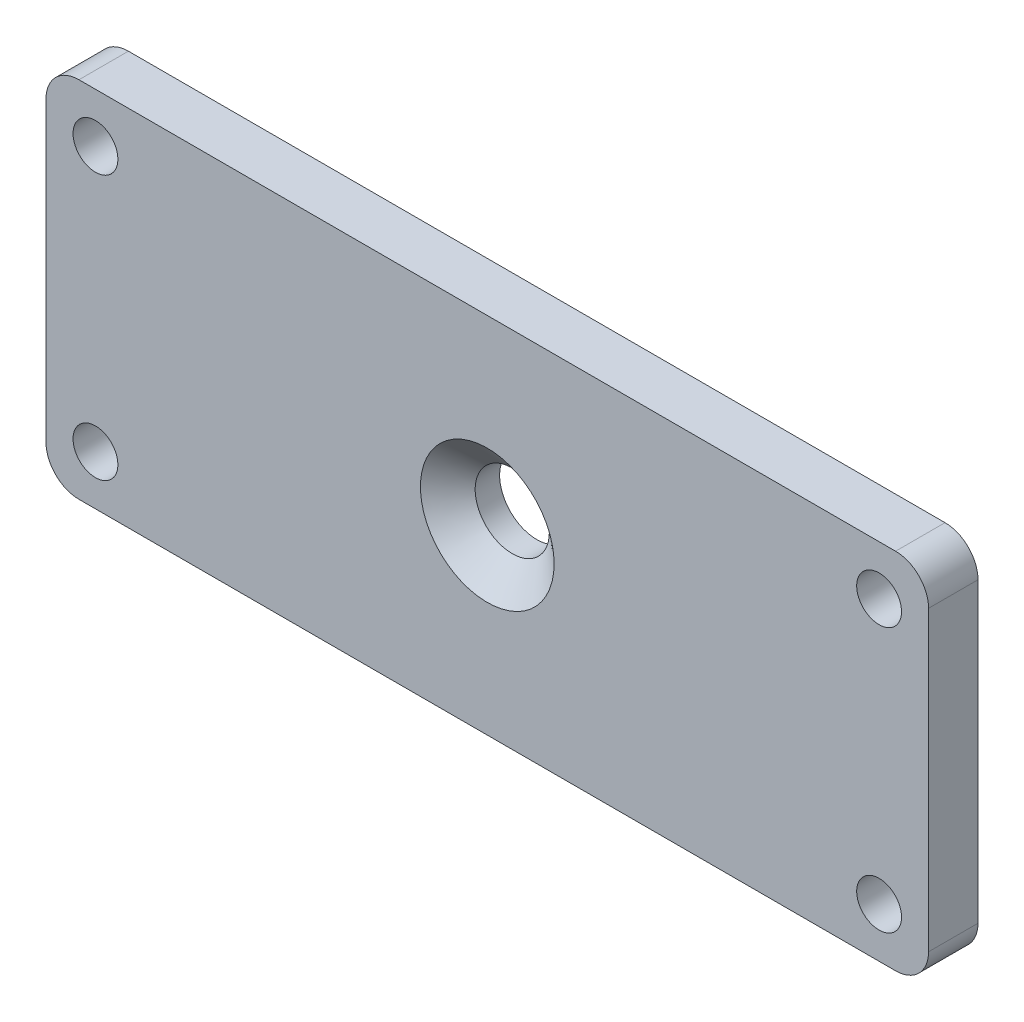
ISO-10303-21;
HEADER;
FILE_DESCRIPTION(('STEP AP214'),'2;1');
FILE_NAME('part.step','',(''),(''),'','','');
FILE_SCHEMA(('AUTOMOTIVE_DESIGN { 1 0 10303 214 1 1 1 1 }'));
ENDSEC;
DATA;
#1=APPLICATION_CONTEXT('core data for automotive mechanical design processes');
#2=APPLICATION_PROTOCOL_DEFINITION('international standard','automotive_design',2000,#1);
#3=PRODUCT_CONTEXT('',#1,'mechanical');
#4=PRODUCT('Part','Part','',(#3));
#5=PRODUCT_RELATED_PRODUCT_CATEGORY('part','',(#4));
#6=PRODUCT_DEFINITION_FORMATION('','',#4);
#7=PRODUCT_DEFINITION_CONTEXT('part definition',#1,'design');
#8=PRODUCT_DEFINITION('design','',#6,#7);
#9=PRODUCT_DEFINITION_SHAPE('','',#8);
#10=(LENGTH_UNIT() NAMED_UNIT(*) SI_UNIT(.MILLI.,.METRE.));
#11=(NAMED_UNIT(*) PLANE_ANGLE_UNIT() SI_UNIT($,.RADIAN.));
#12=(NAMED_UNIT(*) SI_UNIT($,.STERADIAN.) SOLID_ANGLE_UNIT());
#13=UNCERTAINTY_MEASURE_WITH_UNIT(LENGTH_MEASURE(1.E-05),#10,'distance_accuracy_value','');
#14=(GEOMETRIC_REPRESENTATION_CONTEXT(3) GLOBAL_UNCERTAINTY_ASSIGNED_CONTEXT((#13)) GLOBAL_UNIT_ASSIGNED_CONTEXT((#10,
#11,#12)) REPRESENTATION_CONTEXT('',''));
#15=CARTESIAN_POINT('',(0.,0.,0.));
#16=DIRECTION('',(0.,0.,1.));
#17=DIRECTION('',(1.,0.,0.));
#18=AXIS2_PLACEMENT_3D('',#15,#16,#17);
#19=CARTESIAN_POINT('',(42.5,17.5,-4.76250000000002));
#20=DIRECTION('',(0.,0.,1.));
#21=DIRECTION('',(1.,0.,0.));
#22=AXIS2_PLACEMENT_3D('',#19,#20,#21);
#23=PLANE('',#22);
#24=CARTESIAN_POINT('',(0.,0.,-4.76250000000002));
#25=DIRECTION('',(0.,0.,1.));
#26=DIRECTION('',(1.,0.,0.));
#27=AXIS2_PLACEMENT_3D('',#24,#25,#26);
#28=CIRCLE('',#27,3.57123999999999);
#29=CARTESIAN_POINT('',(3.57123999999999,0.,-4.76250000000002));
#30=VERTEX_POINT('',#29);
#31=EDGE_CURVE('E240',#30,#30,#28,.T.);
#32=ORIENTED_EDGE('',*,*,#31,.T.);
#33=EDGE_LOOP('',(#32));
#34=FACE_BOUND('',#33,.T.);
#35=CARTESIAN_POINT('',(-37.7375,-12.7375,-4.76250000000001));
#36=DIRECTION('',(0.,0.,1.));
#37=DIRECTION('',(1.,0.,0.));
#38=AXIS2_PLACEMENT_3D('',#35,#36,#37);
#39=CIRCLE('',#38,2.159);
#40=CARTESIAN_POINT('',(-35.5785,-12.7375,-4.76250000000001));
#41=VERTEX_POINT('',#40);
#42=EDGE_CURVE('E259',#41,#41,#39,.T.);
#43=ORIENTED_EDGE('',*,*,#42,.T.);
#44=EDGE_LOOP('',(#43));
#45=FACE_BOUND('',#44,.T.);
#46=CARTESIAN_POINT('',(37.7375,12.7375,-4.76250000000002));
#47=DIRECTION('',(0.,0.,1.));
#48=DIRECTION('',(1.,0.,0.));
#49=AXIS2_PLACEMENT_3D('',#46,#47,#48);
#50=CIRCLE('',#49,2.159);
#51=CARTESIAN_POINT('',(39.8965,12.7375,-4.76250000000002));
#52=VERTEX_POINT('',#51);
#53=EDGE_CURVE('E256',#52,#52,#50,.T.);
#54=ORIENTED_EDGE('',*,*,#53,.T.);
#55=EDGE_LOOP('',(#54));
#56=FACE_BOUND('',#55,.T.);
#57=CARTESIAN_POINT('',(37.7375,-12.7375,-4.76250000000002));
#58=DIRECTION('',(0.,0.,1.));
#59=DIRECTION('',(1.,0.,0.));
#60=AXIS2_PLACEMENT_3D('',#57,#58,#59);
#61=CIRCLE('',#60,2.159);
#62=CARTESIAN_POINT('',(39.8965,-12.7375,-4.76250000000002));
#63=VERTEX_POINT('',#62);
#64=EDGE_CURVE('E248',#63,#63,#61,.T.);
#65=ORIENTED_EDGE('',*,*,#64,.T.);
#66=EDGE_LOOP('',(#65));
#67=FACE_BOUND('',#66,.T.);
#68=CARTESIAN_POINT('',(-37.7375,12.7375,-4.76250000000001));
#69=DIRECTION('',(0.,0.,1.));
#70=DIRECTION('',(1.,0.,0.));
#71=AXIS2_PLACEMENT_3D('',#68,#69,#70);
#72=CIRCLE('',#71,2.159);
#73=CARTESIAN_POINT('',(-35.5785,12.7375,-4.76250000000001));
#74=VERTEX_POINT('',#73);
#75=EDGE_CURVE('E166',#74,#74,#72,.T.);
#76=ORIENTED_EDGE('',*,*,#75,.T.);
#77=EDGE_LOOP('',(#76));
#78=FACE_BOUND('',#77,.T.);
#79=DIRECTION('',(0.,-1.,0.));
#80=VECTOR('',#79,1.);
#81=CARTESIAN_POINT('',(42.5,17.5,-4.76250000000002));
#82=LINE('',#81,#80);
#83=CARTESIAN_POINT('',(42.5,14.325,-4.76250000000002));
#84=VERTEX_POINT('',#83);
#85=CARTESIAN_POINT('',(42.5,-14.325,-4.76250000000002));
#86=VERTEX_POINT('',#85);
#87=EDGE_CURVE('E102',#84,#86,#82,.T.);
#88=ORIENTED_EDGE('',*,*,#87,.T.);
#89=CARTESIAN_POINT('',(39.325,-14.325,-4.76250000000002));
#90=DIRECTION('',(0.,0.,1.));
#91=DIRECTION('',(1.,0.,0.));
#92=AXIS2_PLACEMENT_3D('',#89,#90,#91);
#93=CIRCLE('',#92,3.175);
#94=CARTESIAN_POINT('',(39.325,-17.5,-4.76250000000002));
#95=VERTEX_POINT('',#94);
#96=EDGE_CURVE('E135',#86,#95,#93,.F.);
#97=ORIENTED_EDGE('',*,*,#96,.T.);
#98=DIRECTION('',(-1.,0.,0.));
#99=VECTOR('',#98,1.);
#100=CARTESIAN_POINT('',(42.5,-17.5,-4.76250000000002));
#101=LINE('',#100,#99);
#102=CARTESIAN_POINT('',(-39.325,-17.5,-4.76250000000001));
#103=VERTEX_POINT('',#102);
#104=EDGE_CURVE('E163',#95,#103,#101,.T.);
#105=ORIENTED_EDGE('',*,*,#104,.T.);
#106=CARTESIAN_POINT('',(-39.325,-14.325,-4.76250000000001));
#107=DIRECTION('',(0.,0.,1.));
#108=DIRECTION('',(1.,0.,0.));
#109=AXIS2_PLACEMENT_3D('',#106,#107,#108);
#110=CIRCLE('',#109,3.175);
#111=CARTESIAN_POINT('',(-42.5,-14.325,-4.76250000000001));
#112=VERTEX_POINT('',#111);
#113=EDGE_CURVE('E108',#103,#112,#110,.F.);
#114=ORIENTED_EDGE('',*,*,#113,.T.);
#115=DIRECTION('',(0.,-1.,0.));
#116=VECTOR('',#115,1.);
#117=CARTESIAN_POINT('',(-42.5,17.5,-4.76250000000001));
#118=LINE('',#117,#116);
#119=CARTESIAN_POINT('',(-42.5,14.325,-4.76250000000001));
#120=VERTEX_POINT('',#119);
#121=EDGE_CURVE('E125',#120,#112,#118,.T.);
#122=ORIENTED_EDGE('',*,*,#121,.F.);
#123=CARTESIAN_POINT('',(-39.325,14.325,-4.76250000000001));
#124=DIRECTION('',(0.,0.,1.));
#125=DIRECTION('',(1.,0.,0.));
#126=AXIS2_PLACEMENT_3D('',#123,#124,#125);
#127=CIRCLE('',#126,3.175);
#128=CARTESIAN_POINT('',(-39.325,17.5,-4.76250000000001));
#129=VERTEX_POINT('',#128);
#130=EDGE_CURVE('E109',#120,#129,#127,.F.);
#131=ORIENTED_EDGE('',*,*,#130,.T.);
#132=DIRECTION('',(-1.,0.,0.));
#133=VECTOR('',#132,1.);
#134=CARTESIAN_POINT('',(42.5,17.5,-4.76250000000002));
#135=LINE('',#134,#133);
#136=CARTESIAN_POINT('',(39.325,17.5,-4.76250000000002));
#137=VERTEX_POINT('',#136);
#138=EDGE_CURVE('E104',#137,#129,#135,.T.);
#139=ORIENTED_EDGE('',*,*,#138,.F.);
#140=CARTESIAN_POINT('',(39.325,14.325,-4.76250000000002));
#141=DIRECTION('',(0.,0.,1.));
#142=DIRECTION('',(1.,0.,0.));
#143=AXIS2_PLACEMENT_3D('',#140,#141,#142);
#144=CIRCLE('',#143,3.175);
#145=EDGE_CURVE('E100',#137,#84,#144,.F.);
#146=ORIENTED_EDGE('',*,*,#145,.T.);
#147=EDGE_LOOP('',(#88,#97,#105,#114,#122,#131,#139,#146));
#148=FACE_BOUND('',#147,.T.);
#149=ADVANCED_FACE('F33',(#34,#45,#56,#67,#78,#148),#23,.F.);
#150=CARTESIAN_POINT('',(-42.5,17.5,-4.76250000000001));
#151=DIRECTION('',(1.,0.,0.));
#152=DIRECTION('',(0.,0.,-1.));
#153=AXIS2_PLACEMENT_3D('',#150,#151,#152);
#154=PLANE('',#153);
#155=ORIENTED_EDGE('',*,*,#121,.T.);
#156=DIRECTION('',(0.,0.,1.));
#157=VECTOR('',#156,1.);
#158=CARTESIAN_POINT('',(-42.5,-14.325,-4.76250000000001));
#159=LINE('',#158,#157);
#160=CARTESIAN_POINT('',(-42.5,-14.325,0.));
#161=VERTEX_POINT('',#160);
#162=EDGE_CURVE('E148',#112,#161,#159,.T.);
#163=ORIENTED_EDGE('',*,*,#162,.T.);
#164=DIRECTION('',(0.,-1.,0.));
#165=VECTOR('',#164,1.);
#166=CARTESIAN_POINT('',(-42.5,17.5,0.));
#167=LINE('',#166,#165);
#168=CARTESIAN_POINT('',(-42.5,14.325,0.));
#169=VERTEX_POINT('',#168);
#170=EDGE_CURVE('E129',#169,#161,#167,.T.);
#171=ORIENTED_EDGE('',*,*,#170,.F.);
#172=DIRECTION('',(0.,0.,1.));
#173=VECTOR('',#172,1.);
#174=CARTESIAN_POINT('',(-42.5,14.325,-4.76250000000001));
#175=LINE('',#174,#173);
#176=EDGE_CURVE('E146',#169,#120,#175,.F.);
#177=ORIENTED_EDGE('',*,*,#176,.T.);
#178=EDGE_LOOP('',(#155,#163,#171,#177));
#179=FACE_BOUND('',#178,.T.);
#180=ADVANCED_FACE('F171',(#179),#154,.F.);
#181=CARTESIAN_POINT('',(-42.5,17.5,0.));
#182=DIRECTION('',(0.,0.,-1.));
#183=DIRECTION('',(-1.,0.,0.));
#184=AXIS2_PLACEMENT_3D('',#181,#182,#183);
#185=PLANE('',#184);
#186=CARTESIAN_POINT('',(0.,0.,0.));
#187=DIRECTION('',(0.,0.,1.));
#188=DIRECTION('',(1.,0.,0.));
#189=AXIS2_PLACEMENT_3D('',#186,#187,#188);
#190=CIRCLE('',#189,6.4389);
#191=CARTESIAN_POINT('',(6.4389,0.,0.));
#192=VERTEX_POINT('',#191);
#193=EDGE_CURVE('E238',#192,#192,#190,.T.);
#194=ORIENTED_EDGE('',*,*,#193,.F.);
#195=EDGE_LOOP('',(#194));
#196=FACE_BOUND('',#195,.T.);
#197=CARTESIAN_POINT('',(-37.7375,-12.7375,0.));
#198=DIRECTION('',(0.,0.,1.));
#199=DIRECTION('',(1.,0.,0.));
#200=AXIS2_PLACEMENT_3D('',#197,#198,#199);
#201=CIRCLE('',#200,2.159);
#202=CARTESIAN_POINT('',(-35.5785,-12.7375,0.));
#203=VERTEX_POINT('',#202);
#204=EDGE_CURVE('E245',#203,#203,#201,.T.);
#205=ORIENTED_EDGE('',*,*,#204,.F.);
#206=EDGE_LOOP('',(#205));
#207=FACE_BOUND('',#206,.T.);
#208=CARTESIAN_POINT('',(37.7375,12.7375,0.));
#209=DIRECTION('',(0.,0.,1.));
#210=DIRECTION('',(1.,0.,0.));
#211=AXIS2_PLACEMENT_3D('',#208,#209,#210);
#212=CIRCLE('',#211,2.159);
#213=CARTESIAN_POINT('',(39.8965,12.7375,0.));
#214=VERTEX_POINT('',#213);
#215=EDGE_CURVE('E249',#214,#214,#212,.T.);
#216=ORIENTED_EDGE('',*,*,#215,.F.);
#217=EDGE_LOOP('',(#216));
#218=FACE_BOUND('',#217,.T.);
#219=CARTESIAN_POINT('',(37.7375,-12.7375,0.));
#220=DIRECTION('',(0.,0.,1.));
#221=DIRECTION('',(1.,0.,0.));
#222=AXIS2_PLACEMENT_3D('',#219,#220,#221);
#223=CIRCLE('',#222,2.159);
#224=CARTESIAN_POINT('',(39.8965,-12.7375,0.));
#225=VERTEX_POINT('',#224);
#226=EDGE_CURVE('E244',#225,#225,#223,.T.);
#227=ORIENTED_EDGE('',*,*,#226,.F.);
#228=EDGE_LOOP('',(#227));
#229=FACE_BOUND('',#228,.T.);
#230=CARTESIAN_POINT('',(-37.7375,12.7375,0.));
#231=DIRECTION('',(0.,0.,1.));
#232=DIRECTION('',(1.,0.,0.));
#233=AXIS2_PLACEMENT_3D('',#230,#231,#232);
#234=CIRCLE('',#233,2.159);
#235=CARTESIAN_POINT('',(-35.5785,12.7375,0.));
#236=VERTEX_POINT('',#235);
#237=EDGE_CURVE('E262',#236,#236,#234,.T.);
#238=ORIENTED_EDGE('',*,*,#237,.F.);
#239=EDGE_LOOP('',(#238));
#240=FACE_BOUND('',#239,.T.);
#241=DIRECTION('',(1.,0.,0.));
#242=VECTOR('',#241,1.);
#243=CARTESIAN_POINT('',(-42.5,-17.5,0.));
#244=LINE('',#243,#242);
#245=CARTESIAN_POINT('',(-39.325,-17.5,0.));
#246=VERTEX_POINT('',#245);
#247=CARTESIAN_POINT('',(39.325,-17.5,0.));
#248=VERTEX_POINT('',#247);
#249=EDGE_CURVE('E159',#246,#248,#244,.T.);
#250=ORIENTED_EDGE('',*,*,#249,.T.);
#251=CARTESIAN_POINT('',(39.325,-14.325,0.));
#252=DIRECTION('',(0.,0.,-1.));
#253=DIRECTION('',(-1.,0.,0.));
#254=AXIS2_PLACEMENT_3D('',#251,#252,#253);
#255=CIRCLE('',#254,3.175);
#256=CARTESIAN_POINT('',(42.5,-14.325,0.));
#257=VERTEX_POINT('',#256);
#258=EDGE_CURVE('E144',#248,#257,#255,.F.);
#259=ORIENTED_EDGE('',*,*,#258,.T.);
#260=DIRECTION('',(0.,-1.,0.));
#261=VECTOR('',#260,1.);
#262=CARTESIAN_POINT('',(42.5,17.5,0.));
#263=LINE('',#262,#261);
#264=CARTESIAN_POINT('',(42.5,14.325,0.));
#265=VERTEX_POINT('',#264);
#266=EDGE_CURVE('E119',#265,#257,#263,.T.);
#267=ORIENTED_EDGE('',*,*,#266,.F.);
#268=CARTESIAN_POINT('',(39.325,14.325,0.));
#269=DIRECTION('',(0.,0.,-1.));
#270=DIRECTION('',(-1.,0.,0.));
#271=AXIS2_PLACEMENT_3D('',#268,#269,#270);
#272=CIRCLE('',#271,3.175);
#273=CARTESIAN_POINT('',(39.325,17.5,0.));
#274=VERTEX_POINT('',#273);
#275=EDGE_CURVE('E124',#265,#274,#272,.F.);
#276=ORIENTED_EDGE('',*,*,#275,.T.);
#277=DIRECTION('',(1.,0.,0.));
#278=VECTOR('',#277,1.);
#279=CARTESIAN_POINT('',(-42.5,17.5,0.));
#280=LINE('',#279,#278);
#281=CARTESIAN_POINT('',(-39.325,17.5,0.));
#282=VERTEX_POINT('',#281);
#283=EDGE_CURVE('E120',#282,#274,#280,.T.);
#284=ORIENTED_EDGE('',*,*,#283,.F.);
#285=CARTESIAN_POINT('',(-39.325,14.325,0.));
#286=DIRECTION('',(0.,0.,-1.));
#287=DIRECTION('',(-1.,0.,0.));
#288=AXIS2_PLACEMENT_3D('',#285,#286,#287);
#289=CIRCLE('',#288,3.175);
#290=EDGE_CURVE('E56',#282,#169,#289,.F.);
#291=ORIENTED_EDGE('',*,*,#290,.T.);
#292=ORIENTED_EDGE('',*,*,#170,.T.);
#293=CARTESIAN_POINT('',(-39.325,-14.325,0.));
#294=DIRECTION('',(0.,0.,-1.));
#295=DIRECTION('',(-1.,0.,0.));
#296=AXIS2_PLACEMENT_3D('',#293,#294,#295);
#297=CIRCLE('',#296,3.175);
#298=EDGE_CURVE('E48',#161,#246,#297,.F.);
#299=ORIENTED_EDGE('',*,*,#298,.T.);
#300=EDGE_LOOP('',(#250,#259,#267,#276,#284,#291,#292,#299));
#301=FACE_BOUND('',#300,.T.);
#302=ADVANCED_FACE('F157',(#196,#207,#218,#229,#240,#301),#185,.F.);
#303=CARTESIAN_POINT('',(42.5,17.5,0.));
#304=DIRECTION('',(-1.,0.,0.));
#305=DIRECTION('',(0.,0.,1.));
#306=AXIS2_PLACEMENT_3D('',#303,#304,#305);
#307=PLANE('',#306);
#308=ORIENTED_EDGE('',*,*,#266,.T.);
#309=DIRECTION('',(0.,0.,-1.));
#310=VECTOR('',#309,1.);
#311=CARTESIAN_POINT('',(42.5,-14.325,0.));
#312=LINE('',#311,#310);
#313=EDGE_CURVE('E118',#257,#86,#312,.T.);
#314=ORIENTED_EDGE('',*,*,#313,.T.);
#315=ORIENTED_EDGE('',*,*,#87,.F.);
#316=DIRECTION('',(0.,0.,-1.));
#317=VECTOR('',#316,1.);
#318=CARTESIAN_POINT('',(42.5,14.325,0.));
#319=LINE('',#318,#317);
#320=EDGE_CURVE('E115',#84,#265,#319,.F.);
#321=ORIENTED_EDGE('',*,*,#320,.T.);
#322=EDGE_LOOP('',(#308,#314,#315,#321));
#323=FACE_BOUND('',#322,.T.);
#324=ADVANCED_FACE('F114',(#323),#307,.F.);
#325=CARTESIAN_POINT('',(0.,17.5,0.));
#326=DIRECTION('',(0.,1.,0.));
#327=DIRECTION('',(0.,0.,1.));
#328=AXIS2_PLACEMENT_3D('',#325,#326,#327);
#329=PLANE('',#328);
#330=ORIENTED_EDGE('',*,*,#283,.T.);
#331=DIRECTION('',(0.,0.,-1.));
#332=VECTOR('',#331,1.);
#333=CARTESIAN_POINT('',(39.325,17.5,-4.76250000000002));
#334=LINE('',#333,#332);
#335=EDGE_CURVE('E11',#274,#137,#334,.T.);
#336=ORIENTED_EDGE('',*,*,#335,.T.);
#337=ORIENTED_EDGE('',*,*,#138,.T.);
#338=DIRECTION('',(0.,0.,1.));
#339=VECTOR('',#338,1.);
#340=CARTESIAN_POINT('',(-39.325,17.5,0.));
#341=LINE('',#340,#339);
#342=EDGE_CURVE('E41',#129,#282,#341,.T.);
#343=ORIENTED_EDGE('',*,*,#342,.T.);
#344=EDGE_LOOP('',(#330,#336,#337,#343));
#345=FACE_BOUND('',#344,.T.);
#346=ADVANCED_FACE('F153',(#345),#329,.T.);
#347=CARTESIAN_POINT('',(0.,-17.5,0.));
#348=DIRECTION('',(0.,1.,0.));
#349=DIRECTION('',(0.,0.,1.));
#350=AXIS2_PLACEMENT_3D('',#347,#348,#349);
#351=PLANE('',#350);
#352=ORIENTED_EDGE('',*,*,#104,.F.);
#353=DIRECTION('',(0.,0.,-1.));
#354=VECTOR('',#353,1.);
#355=CARTESIAN_POINT('',(39.325,-17.5,0.));
#356=LINE('',#355,#354);
#357=EDGE_CURVE('E139',#95,#248,#356,.F.);
#358=ORIENTED_EDGE('',*,*,#357,.T.);
#359=ORIENTED_EDGE('',*,*,#249,.F.);
#360=DIRECTION('',(0.,0.,1.));
#361=VECTOR('',#360,1.);
#362=CARTESIAN_POINT('',(-39.325,-17.5,0.));
#363=LINE('',#362,#361);
#364=EDGE_CURVE('E137',#246,#103,#363,.F.);
#365=ORIENTED_EDGE('',*,*,#364,.T.);
#366=EDGE_LOOP('',(#352,#358,#359,#365));
#367=FACE_BOUND('',#366,.T.);
#368=ADVANCED_FACE('F177',(#367),#351,.F.);
#369=CARTESIAN_POINT('',(39.325,-14.325,0.));
#370=DIRECTION('',(0.,0.,-1.));
#371=DIRECTION('',(-1.,0.,0.));
#372=AXIS2_PLACEMENT_3D('',#369,#370,#371);
#373=CYLINDRICAL_SURFACE('',#372,3.175);
#374=ORIENTED_EDGE('',*,*,#258,.F.);
#375=ORIENTED_EDGE('',*,*,#357,.F.);
#376=ORIENTED_EDGE('',*,*,#96,.F.);
#377=ORIENTED_EDGE('',*,*,#313,.F.);
#378=EDGE_LOOP('',(#374,#375,#376,#377));
#379=FACE_BOUND('',#378,.T.);
#380=ADVANCED_FACE('F181',(#379),#373,.T.);
#381=CARTESIAN_POINT('',(-39.325,-14.325,-4.76250000000001));
#382=DIRECTION('',(0.,0.,1.));
#383=DIRECTION('',(1.,0.,0.));
#384=AXIS2_PLACEMENT_3D('',#381,#382,#383);
#385=CYLINDRICAL_SURFACE('',#384,3.175);
#386=ORIENTED_EDGE('',*,*,#113,.F.);
#387=ORIENTED_EDGE('',*,*,#364,.F.);
#388=ORIENTED_EDGE('',*,*,#298,.F.);
#389=ORIENTED_EDGE('',*,*,#162,.F.);
#390=EDGE_LOOP('',(#386,#387,#388,#389));
#391=FACE_BOUND('',#390,.T.);
#392=ADVANCED_FACE('F174',(#391),#385,.T.);
#393=CARTESIAN_POINT('',(39.325,14.325,0.));
#394=DIRECTION('',(0.,0.,1.));
#395=DIRECTION('',(1.,0.,0.));
#396=AXIS2_PLACEMENT_3D('',#393,#394,#395);
#397=CYLINDRICAL_SURFACE('',#396,3.175);
#398=ORIENTED_EDGE('',*,*,#275,.F.);
#399=ORIENTED_EDGE('',*,*,#320,.F.);
#400=ORIENTED_EDGE('',*,*,#145,.F.);
#401=ORIENTED_EDGE('',*,*,#335,.F.);
#402=EDGE_LOOP('',(#398,#399,#400,#401));
#403=FACE_BOUND('',#402,.T.);
#404=ADVANCED_FACE('F123',(#403),#397,.T.);
#405=CARTESIAN_POINT('',(-39.325,14.325,0.));
#406=DIRECTION('',(0.,0.,-1.));
#407=DIRECTION('',(-1.,0.,0.));
#408=AXIS2_PLACEMENT_3D('',#405,#406,#407);
#409=CYLINDRICAL_SURFACE('',#408,3.175);
#410=ORIENTED_EDGE('',*,*,#130,.F.);
#411=ORIENTED_EDGE('',*,*,#176,.F.);
#412=ORIENTED_EDGE('',*,*,#290,.F.);
#413=ORIENTED_EDGE('',*,*,#342,.F.);
#414=EDGE_LOOP('',(#410,#411,#412,#413));
#415=FACE_BOUND('',#414,.T.);
#416=ADVANCED_FACE('F35',(#415),#409,.T.);
#417=CARTESIAN_POINT('',(-37.7375,12.7375,-10.));
#418=DIRECTION('',(0.,0.,1.));
#419=DIRECTION('',(1.,0.,0.));
#420=AXIS2_PLACEMENT_3D('',#417,#418,#419);
#421=CYLINDRICAL_SURFACE('',#420,2.159);
#422=ORIENTED_EDGE('',*,*,#237,.T.);
#423=EDGE_LOOP('',(#422));
#424=FACE_BOUND('',#423,.T.);
#425=ORIENTED_EDGE('',*,*,#75,.F.);
#426=EDGE_LOOP('',(#425));
#427=FACE_BOUND('',#426,.T.);
#428=ADVANCED_FACE('F207',(#424,#427),#421,.F.);
#429=CARTESIAN_POINT('',(37.7375,-12.7375,-10.));
#430=DIRECTION('',(0.,0.,1.));
#431=DIRECTION('',(1.,0.,0.));
#432=AXIS2_PLACEMENT_3D('',#429,#430,#431);
#433=CYLINDRICAL_SURFACE('',#432,2.159);
#434=ORIENTED_EDGE('',*,*,#226,.T.);
#435=EDGE_LOOP('',(#434));
#436=FACE_BOUND('',#435,.T.);
#437=ORIENTED_EDGE('',*,*,#64,.F.);
#438=EDGE_LOOP('',(#437));
#439=FACE_BOUND('',#438,.T.);
#440=ADVANCED_FACE('F210',(#436,#439),#433,.F.);
#441=CARTESIAN_POINT('',(37.7375,12.7375,-10.));
#442=DIRECTION('',(0.,0.,1.));
#443=DIRECTION('',(1.,0.,0.));
#444=AXIS2_PLACEMENT_3D('',#441,#442,#443);
#445=CYLINDRICAL_SURFACE('',#444,2.159);
#446=ORIENTED_EDGE('',*,*,#215,.T.);
#447=EDGE_LOOP('',(#446));
#448=FACE_BOUND('',#447,.T.);
#449=ORIENTED_EDGE('',*,*,#53,.F.);
#450=EDGE_LOOP('',(#449));
#451=FACE_BOUND('',#450,.T.);
#452=ADVANCED_FACE('F214',(#448,#451),#445,.F.);
#453=CARTESIAN_POINT('',(-37.7375,-12.7375,-10.));
#454=DIRECTION('',(0.,0.,1.));
#455=DIRECTION('',(1.,0.,0.));
#456=AXIS2_PLACEMENT_3D('',#453,#454,#455);
#457=CYLINDRICAL_SURFACE('',#456,2.159);
#458=ORIENTED_EDGE('',*,*,#204,.T.);
#459=EDGE_LOOP('',(#458));
#460=FACE_BOUND('',#459,.T.);
#461=ORIENTED_EDGE('',*,*,#42,.F.);
#462=EDGE_LOOP('',(#461));
#463=FACE_BOUND('',#462,.T.);
#464=ADVANCED_FACE('F218',(#460,#463),#457,.F.);
#465=CARTESIAN_POINT('',(0.,0.,0.));
#466=DIRECTION('',(0.,0.,1.));
#467=DIRECTION('',(1.,0.,0.));
#468=AXIS2_PLACEMENT_3D('',#465,#466,#467);
#469=CYLINDRICAL_SURFACE('',#468,3.57123999999999);
#470=ORIENTED_EDGE('',*,*,#31,.F.);
#471=EDGE_LOOP('',(#470));
#472=FACE_BOUND('',#471,.T.);
#473=CARTESIAN_POINT('',(0.,0.,-2.40625244834183));
#474=DIRECTION('',(0.,0.,1.));
#475=DIRECTION('',(1.,0.,0.));
#476=AXIS2_PLACEMENT_3D('',#473,#474,#475);
#477=CIRCLE('',#476,3.57123999999999);
#478=CARTESIAN_POINT('',(3.57123999999999,0.,-2.40625244834183));
#479=VERTEX_POINT('',#478);
#480=EDGE_CURVE('E235',#479,#479,#477,.T.);
#481=ORIENTED_EDGE('',*,*,#480,.T.);
#482=EDGE_LOOP('',(#481));
#483=FACE_BOUND('',#482,.T.);
#484=ADVANCED_FACE('F222',(#472,#483),#469,.F.);
#485=CARTESIAN_POINT('',(0.,0.,0.));
#486=DIRECTION('',(0.,0.,1.));
#487=DIRECTION('',(1.,0.,0.));
#488=AXIS2_PLACEMENT_3D('',#485,#486,#487);
#489=CONICAL_SURFACE('',#488,6.4389,0.872664625997168);
#490=ORIENTED_EDGE('',*,*,#480,.F.);
#491=EDGE_LOOP('',(#490));
#492=FACE_BOUND('',#491,.T.);
#493=ORIENTED_EDGE('',*,*,#193,.T.);
#494=EDGE_LOOP('',(#493));
#495=FACE_BOUND('',#494,.T.);
#496=ADVANCED_FACE('F226',(#492,#495),#489,.F.);
#497=CLOSED_SHELL('',(#149,#180,#302,#324,#346,#368,#380,#392,#404,#416,#428,#440,#452,#464,
#484,#496));
#498=MANIFOLD_SOLID_BREP('B2',#497);
#499=ADVANCED_BREP_SHAPE_REPRESENTATION('',(#18,#498),#14);
#500=SHAPE_DEFINITION_REPRESENTATION(#9,#499);
ENDSEC;
END-ISO-10303-21;
